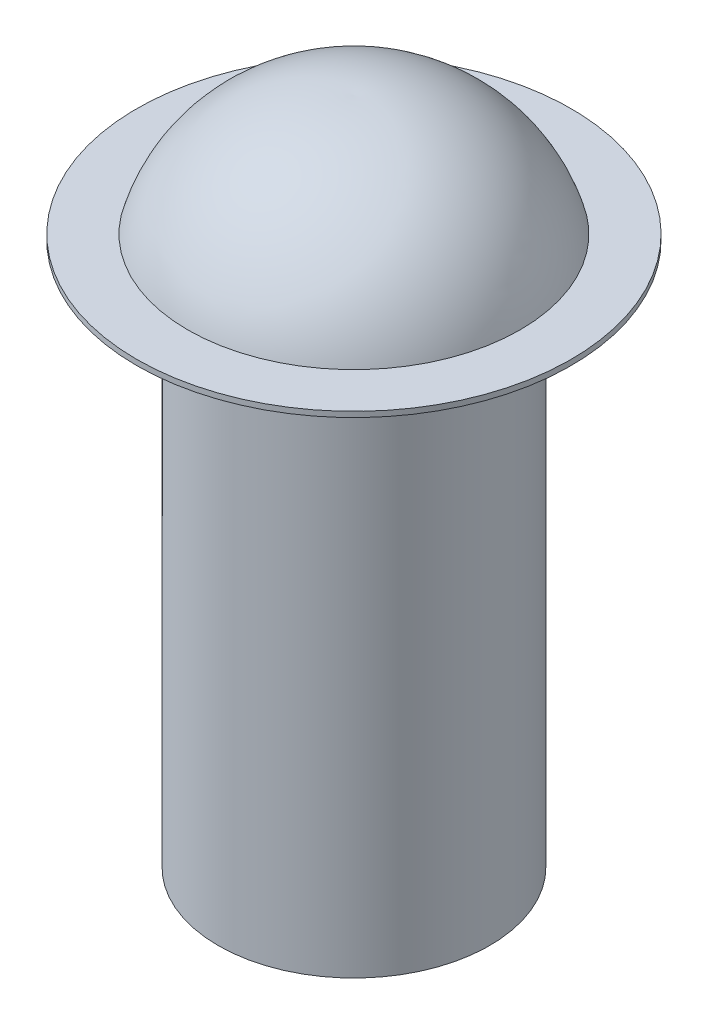
ISO-10303-21;
HEADER;
FILE_DESCRIPTION(('STEP AP214'),'2;1');
FILE_NAME('part.step','',(''),(''),'','','');
FILE_SCHEMA(('AUTOMOTIVE_DESIGN { 1 0 10303 214 1 1 1 1 }'));
ENDSEC;
DATA;
#1=APPLICATION_CONTEXT('core data for automotive mechanical design processes');
#2=APPLICATION_PROTOCOL_DEFINITION('international standard','automotive_design',2000,#1);
#3=PRODUCT_CONTEXT('',#1,'mechanical');
#4=PRODUCT('Part','Part','',(#3));
#5=PRODUCT_RELATED_PRODUCT_CATEGORY('part','',(#4));
#6=PRODUCT_DEFINITION_FORMATION('','',#4);
#7=PRODUCT_DEFINITION_CONTEXT('part definition',#1,'design');
#8=PRODUCT_DEFINITION('design','',#6,#7);
#9=PRODUCT_DEFINITION_SHAPE('','',#8);
#10=(LENGTH_UNIT() NAMED_UNIT(*) SI_UNIT(.MILLI.,.METRE.));
#11=(NAMED_UNIT(*) PLANE_ANGLE_UNIT() SI_UNIT($,.RADIAN.));
#12=(NAMED_UNIT(*) SI_UNIT($,.STERADIAN.) SOLID_ANGLE_UNIT());
#13=UNCERTAINTY_MEASURE_WITH_UNIT(LENGTH_MEASURE(1.E-05),#10,'distance_accuracy_value','');
#14=(GEOMETRIC_REPRESENTATION_CONTEXT(3) GLOBAL_UNCERTAINTY_ASSIGNED_CONTEXT((#13)) GLOBAL_UNIT_ASSIGNED_CONTEXT((#10,
#11,#12)) REPRESENTATION_CONTEXT('',''));
#15=CARTESIAN_POINT('',(0.,0.,0.));
#16=DIRECTION('',(0.,0.,1.));
#17=DIRECTION('',(1.,0.,0.));
#18=AXIS2_PLACEMENT_3D('',#15,#16,#17);
#19=CARTESIAN_POINT('',(0.,12.7,0.));
#20=DIRECTION('',(0.,-1.,0.));
#21=DIRECTION('',(0.,0.,-1.));
#22=AXIS2_PLACEMENT_3D('',#19,#20,#21);
#23=CYLINDRICAL_SURFACE('',#22,3.175);
#24=CARTESIAN_POINT('',(0.,12.7,0.));
#25=DIRECTION('',(0.,1.,0.));
#26=DIRECTION('',(0.,0.,1.));
#27=AXIS2_PLACEMENT_3D('',#24,#25,#26);
#28=CIRCLE('',#27,3.175);
#29=CARTESIAN_POINT('',(0.,12.7,3.175));
#30=VERTEX_POINT('',#29);
#31=EDGE_CURVE('E11',#30,#30,#28,.T.);
#32=ORIENTED_EDGE('',*,*,#31,.F.);
#33=EDGE_LOOP('',(#32));
#34=FACE_BOUND('',#33,.T.);
#35=CARTESIAN_POINT('',(0.,0.,0.));
#36=DIRECTION('',(0.,1.,0.));
#37=DIRECTION('',(0.,0.,1.));
#38=AXIS2_PLACEMENT_3D('',#35,#36,#37);
#39=CIRCLE('',#38,3.175);
#40=CARTESIAN_POINT('',(0.,0.,3.175));
#41=VERTEX_POINT('',#40);
#42=EDGE_CURVE('E35',#41,#41,#39,.T.);
#43=ORIENTED_EDGE('',*,*,#42,.T.);
#44=EDGE_LOOP('',(#43));
#45=FACE_BOUND('',#44,.T.);
#46=ADVANCED_FACE('F32',(#34,#45),#23,.T.);
#47=CARTESIAN_POINT('',(0.,0.,0.));
#48=DIRECTION('',(0.,1.,0.));
#49=DIRECTION('',(0.,0.,1.));
#50=AXIS2_PLACEMENT_3D('',#47,#48,#49);
#51=PLANE('',#50);
#52=ORIENTED_EDGE('',*,*,#42,.F.);
#53=EDGE_LOOP('',(#52));
#54=FACE_BOUND('',#53,.T.);
#55=ADVANCED_FACE('F55',(#54),#51,.F.);
#56=CARTESIAN_POINT('',(0.,12.827,0.));
#57=DIRECTION('',(0.,-1.,0.));
#58=DIRECTION('',(0.,0.,-1.));
#59=AXIS2_PLACEMENT_3D('',#56,#57,#58);
#60=CYLINDRICAL_SURFACE('',#59,5.08);
#61=CARTESIAN_POINT('',(0.,12.827,0.));
#62=DIRECTION('',(0.,1.,0.));
#63=DIRECTION('',(0.,0.,1.));
#64=AXIS2_PLACEMENT_3D('',#61,#62,#63);
#65=CIRCLE('',#64,5.08);
#66=CARTESIAN_POINT('',(0.,12.827,5.08));
#67=VERTEX_POINT('',#66);
#68=EDGE_CURVE('E66',#67,#67,#65,.T.);
#69=ORIENTED_EDGE('',*,*,#68,.F.);
#70=EDGE_LOOP('',(#69));
#71=FACE_BOUND('',#70,.T.);
#72=CARTESIAN_POINT('',(0.,12.7,0.));
#73=DIRECTION('',(0.,1.,0.));
#74=DIRECTION('',(0.,0.,1.));
#75=AXIS2_PLACEMENT_3D('',#72,#73,#74);
#76=CIRCLE('',#75,5.08);
#77=CARTESIAN_POINT('',(0.,12.7,5.08));
#78=VERTEX_POINT('',#77);
#79=EDGE_CURVE('E68',#78,#78,#76,.T.);
#80=ORIENTED_EDGE('',*,*,#79,.T.);
#81=EDGE_LOOP('',(#80));
#82=FACE_BOUND('',#81,.T.);
#83=ADVANCED_FACE('F60',(#71,#82),#60,.T.);
#84=CARTESIAN_POINT('',(0.,12.827,0.));
#85=DIRECTION('',(0.,1.,0.));
#86=DIRECTION('',(0.,0.,1.));
#87=AXIS2_PLACEMENT_3D('',#84,#85,#86);
#88=PLANE('',#87);
#89=CARTESIAN_POINT('',(0.,12.827,0.));
#90=DIRECTION('',(0.,-1.,0.));
#91=DIRECTION('',(0.,0.,-1.));
#92=AXIS2_PLACEMENT_3D('',#89,#90,#91);
#93=CIRCLE('',#92,3.88632923932564);
#94=CARTESIAN_POINT('',(0.,12.827,-3.88632923932564));
#95=VERTEX_POINT('',#94);
#96=EDGE_CURVE('E73',#95,#95,#93,.T.);
#97=ORIENTED_EDGE('',*,*,#96,.T.);
#98=EDGE_LOOP('',(#97));
#99=FACE_BOUND('',#98,.T.);
#100=ORIENTED_EDGE('',*,*,#68,.T.);
#101=EDGE_LOOP('',(#100));
#102=FACE_BOUND('',#101,.T.);
#103=ADVANCED_FACE('F49',(#99,#102),#88,.T.);
#104=CARTESIAN_POINT('',(0.,12.7,0.));
#105=DIRECTION('',(0.,1.,0.));
#106=DIRECTION('',(0.,0.,1.));
#107=AXIS2_PLACEMENT_3D('',#104,#105,#106);
#108=PLANE('',#107);
#109=ORIENTED_EDGE('',*,*,#31,.T.);
#110=EDGE_LOOP('',(#109));
#111=FACE_BOUND('',#110,.T.);
#112=ORIENTED_EDGE('',*,*,#79,.F.);
#113=EDGE_LOOP('',(#112));
#114=FACE_BOUND('',#113,.T.);
#115=ADVANCED_FACE('F43',(#111,#114),#108,.F.);
#116=CARTESIAN_POINT('',(0.,11.7893707464386,-0.166551769304525));
#117=DIRECTION('',(-1.,0.,0.));
#118=DIRECTION('',(0.,0.,-1.));
#119=AXIS2_PLACEMENT_3D('',#116,#117,#118);
#120=CIRCLE('',#119,3.86178959736584);
#121=TRIMMED_CURVE('',#120,(PARAMETER_VALUE(-1.61393783940422)),
(PARAMETER_VALUE(1.61393783940422)),.T.,.PARAMETER.);
#122=CARTESIAN_POINT('',(0.,11.7893707464386,0.));
#123=DIRECTION('',(0.,-1.,0.));
#124=AXIS1_PLACEMENT('',#122,#123);
#125=SURFACE_OF_REVOLUTION('',#121,#124);
#126=ORIENTED_EDGE('',*,*,#96,.F.);
#127=EDGE_LOOP('',(#126));
#128=FACE_BOUND('',#127,.T.);
#129=CARTESIAN_POINT('',(0.,15.6475671388563,0.));
#130=VERTEX_POINT('',#129);
#131=VERTEX_LOOP('',#130);
#132=FACE_BOUND('',#131,.T.);
#133=ADVANCED_FACE('F41',(#128,#132),#125,.T.);
#134=CLOSED_SHELL('',(#46,#55,#83,#103,#115,#133));
#135=MANIFOLD_SOLID_BREP('B2',#134);
#136=ADVANCED_BREP_SHAPE_REPRESENTATION('',(#18,#135),#14);
#137=SHAPE_DEFINITION_REPRESENTATION(#9,#136);
ENDSEC;
END-ISO-10303-21;
